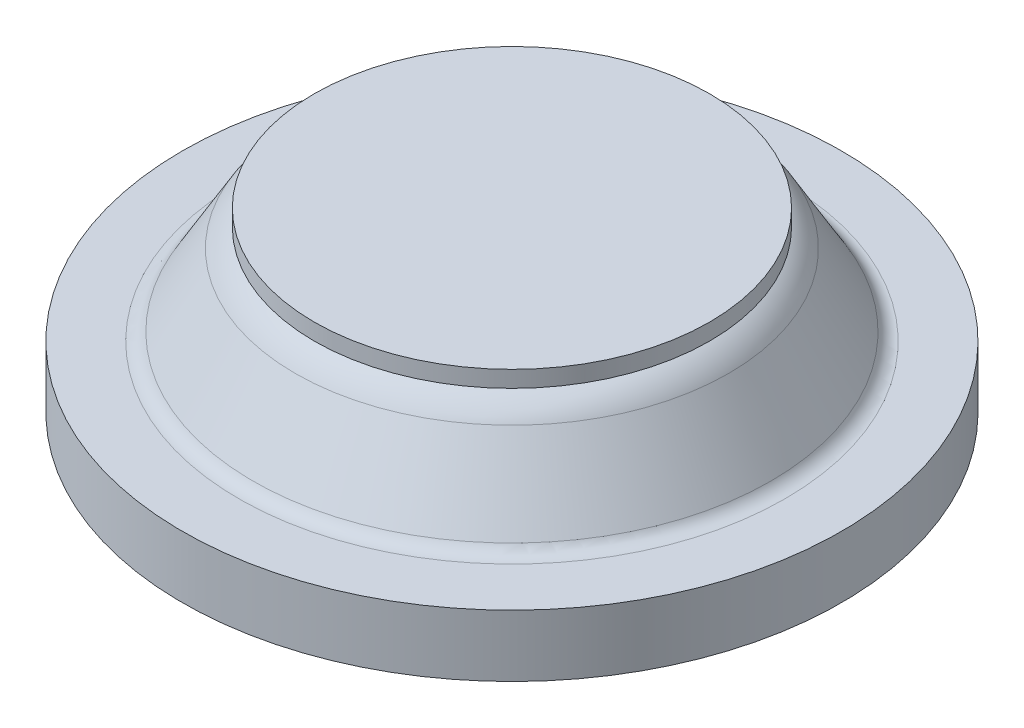
ISO-10303-21;
HEADER;
FILE_DESCRIPTION(('STEP AP214'),'2;1');
FILE_NAME('part.step','',(''),(''),'','','');
FILE_SCHEMA(('AUTOMOTIVE_DESIGN { 1 0 10303 214 1 1 1 1 }'));
ENDSEC;
DATA;
#1=APPLICATION_CONTEXT('core data for automotive mechanical design processes');
#2=APPLICATION_PROTOCOL_DEFINITION('international standard','automotive_design',2000,#1);
#3=PRODUCT_CONTEXT('',#1,'mechanical');
#4=PRODUCT('Part','Part','',(#3));
#5=PRODUCT_RELATED_PRODUCT_CATEGORY('part','',(#4));
#6=PRODUCT_DEFINITION_FORMATION('','',#4);
#7=PRODUCT_DEFINITION_CONTEXT('part definition',#1,'design');
#8=PRODUCT_DEFINITION('design','',#6,#7);
#9=PRODUCT_DEFINITION_SHAPE('','',#8);
#10=(LENGTH_UNIT() NAMED_UNIT(*) SI_UNIT(.MILLI.,.METRE.));
#11=(NAMED_UNIT(*) PLANE_ANGLE_UNIT() SI_UNIT($,.RADIAN.));
#12=(NAMED_UNIT(*) SI_UNIT($,.STERADIAN.) SOLID_ANGLE_UNIT());
#13=UNCERTAINTY_MEASURE_WITH_UNIT(LENGTH_MEASURE(1.E-05),#10,'distance_accuracy_value','');
#14=(GEOMETRIC_REPRESENTATION_CONTEXT(3) GLOBAL_UNCERTAINTY_ASSIGNED_CONTEXT((#13)) GLOBAL_UNIT_ASSIGNED_CONTEXT((#10,
#11,#12)) REPRESENTATION_CONTEXT('',''));
#15=CARTESIAN_POINT('',(0.,0.,0.));
#16=DIRECTION('',(0.,0.,1.));
#17=DIRECTION('',(1.,0.,0.));
#18=AXIS2_PLACEMENT_3D('',#15,#16,#17);
#19=CARTESIAN_POINT('',(0.,-15.24,0.));
#20=DIRECTION('',(0.,-1.,0.));
#21=DIRECTION('',(1.,0.,0.));
#22=AXIS2_PLACEMENT_3D('',#19,#20,#21);
#23=CONICAL_SURFACE('',#22,40.64,0.528074448426359);
#24=CARTESIAN_POINT('',(0.,-2.84958463915346,0.));
#25=DIRECTION('',(0.,1.,0.));
#26=DIRECTION('',(-1.,0.,0.));
#27=AXIS2_PLACEMENT_3D('',#24,#25,#26);
#28=CIRCLE('',#27,33.4122577061729);
#29=CARTESIAN_POINT('',(-33.4122577061729,-2.84958463915347,0.));
#30=VERTEX_POINT('',#29);
#31=EDGE_CURVE('E10',#30,#30,#28,.F.);
#32=ORIENTED_EDGE('',*,*,#31,.T.);
#33=EDGE_LOOP('',(#32));
#34=FACE_BOUND('',#33,.T.);
#35=CARTESIAN_POINT('',(0.,-13.9798324048312,0.));
#36=DIRECTION('',(0.,-1.,0.));
#37=DIRECTION('',(1.,0.,0.));
#38=AXIS2_PLACEMENT_3D('',#35,#36,#37);
#39=CIRCLE('',#38,39.9049022361515);
#40=CARTESIAN_POINT('',(39.9049022361515,-13.9798324048312,0.));
#41=VERTEX_POINT('',#40);
#42=EDGE_CURVE('E39',#41,#41,#39,.F.);
#43=ORIENTED_EDGE('',*,*,#42,.T.);
#44=EDGE_LOOP('',(#43));
#45=FACE_BOUND('',#44,.T.);
#46=ADVANCED_FACE('F32',(#34,#45),#23,.T.);
#47=CARTESIAN_POINT('',(0.,2.54,0.));
#48=DIRECTION('',(0.,-1.,0.));
#49=DIRECTION('',(0.,0.,-1.));
#50=AXIS2_PLACEMENT_3D('',#47,#48,#49);
#51=CYLINDRICAL_SURFACE('',#50,30.48);
#52=CARTESIAN_POINT('',(0.,2.54,0.));
#53=DIRECTION('',(0.,1.,0.));
#54=DIRECTION('',(0.,0.,1.));
#55=AXIS2_PLACEMENT_3D('',#52,#53,#54);
#56=CIRCLE('',#55,30.48);
#57=CARTESIAN_POINT('',(0.,2.54,30.48));
#58=VERTEX_POINT('',#57);
#59=EDGE_CURVE('E52',#58,#58,#56,.T.);
#60=ORIENTED_EDGE('',*,*,#59,.F.);
#61=EDGE_LOOP('',(#60));
#62=FACE_BOUND('',#61,.T.);
#63=CARTESIAN_POINT('',(0.,0.,0.));
#64=DIRECTION('',(0.,-1.,0.));
#65=DIRECTION('',(1.,0.,0.));
#66=AXIS2_PLACEMENT_3D('',#63,#64,#65);
#67=CIRCLE('',#66,30.48);
#68=CARTESIAN_POINT('',(30.48,0.,0.));
#69=VERTEX_POINT('',#68);
#70=EDGE_CURVE('E47',#69,#69,#67,.F.);
#71=ORIENTED_EDGE('',*,*,#70,.T.);
#72=EDGE_LOOP('',(#71));
#73=FACE_BOUND('',#72,.T.);
#74=ADVANCED_FACE('F83',(#62,#73),#51,.T.);
#75=CARTESIAN_POINT('',(0.,2.54,0.));
#76=DIRECTION('',(0.,1.,0.));
#77=DIRECTION('',(0.,0.,1.));
#78=AXIS2_PLACEMENT_3D('',#75,#76,#77);
#79=PLANE('',#78);
#80=ORIENTED_EDGE('',*,*,#59,.T.);
#81=EDGE_LOOP('',(#80));
#82=FACE_BOUND('',#81,.T.);
#83=ADVANCED_FACE('F67',(#82),#79,.T.);
#84=CARTESIAN_POINT('',(0.,-24.765,0.));
#85=DIRECTION('',(0.,1.,0.));
#86=DIRECTION('',(-1.,0.,0.));
#87=AXIS2_PLACEMENT_3D('',#84,#85,#86);
#88=CYLINDRICAL_SURFACE('',#87,50.8);
#89=CARTESIAN_POINT('',(0.,-24.765,0.));
#90=DIRECTION('',(0.,-1.,0.));
#91=DIRECTION('',(1.,0.,0.));
#92=AXIS2_PLACEMENT_3D('',#89,#90,#91);
#93=CIRCLE('',#92,50.8);
#94=CARTESIAN_POINT('',(-50.8,-24.765,0.));
#95=VERTEX_POINT('',#94);
#96=EDGE_CURVE('E55',#95,#95,#93,.T.);
#97=CARTESIAN_POINT('',(0.,-15.24,0.));
#98=DIRECTION('',(0.,-1.,0.));
#99=DIRECTION('',(1.,0.,0.));
#100=AXIS2_PLACEMENT_3D('',#97,#98,#99);
#101=CIRCLE('',#100,50.8);
#102=CARTESIAN_POINT('',(-50.8,-15.24,0.));
#103=VERTEX_POINT('',#102);
#104=EDGE_CURVE('E56',#103,#103,#101,.T.);
#105=CARTESIAN_POINT('',(-50.8,-24.765,0.));
#106=CARTESIAN_POINT('',(-50.8,-24.66578125,0.));
#107=CARTESIAN_POINT('',(-50.8,-24.5665625,0.));
#108=CARTESIAN_POINT('',(-50.8,-24.368125,0.));
#109=CARTESIAN_POINT('',(-50.8,-24.26890625,0.));
#110=CARTESIAN_POINT('',(-50.8,-24.07046875,0.));
#111=CARTESIAN_POINT('',(-50.8,-23.97125,0.));
#112=CARTESIAN_POINT('',(-50.8,-23.7728125,0.));
#113=CARTESIAN_POINT('',(-50.8,-23.67359375,0.));
#114=CARTESIAN_POINT('',(-50.8,-23.47515625,0.));
#115=CARTESIAN_POINT('',(-50.8,-23.3759375,0.));
#116=CARTESIAN_POINT('',(-50.8,-23.1775,0.));
#117=CARTESIAN_POINT('',(-50.8,-23.07828125,0.));
#118=CARTESIAN_POINT('',(-50.8,-22.87984375,0.));
#119=CARTESIAN_POINT('',(-50.8,-22.780625,0.));
#120=CARTESIAN_POINT('',(-50.8,-22.5821875,0.));
#121=CARTESIAN_POINT('',(-50.8,-22.48296875,0.));
#122=CARTESIAN_POINT('',(-50.8,-22.28453125,0.));
#123=CARTESIAN_POINT('',(-50.8,-22.1853125,0.));
#124=CARTESIAN_POINT('',(-50.8,-21.986875,0.));
#125=CARTESIAN_POINT('',(-50.8,-21.88765625,0.));
#126=CARTESIAN_POINT('',(-50.8,-21.68921875,0.));
#127=CARTESIAN_POINT('',(-50.8,-21.59,0.));
#128=CARTESIAN_POINT('',(-50.8,-21.3915625,0.));
#129=CARTESIAN_POINT('',(-50.8,-21.29234375,0.));
#130=CARTESIAN_POINT('',(-50.8,-21.09390625,0.));
#131=CARTESIAN_POINT('',(-50.8,-20.9946875,0.));
#132=CARTESIAN_POINT('',(-50.8,-20.79625,0.));
#133=CARTESIAN_POINT('',(-50.8,-20.69703125,0.));
#134=CARTESIAN_POINT('',(-50.8,-20.49859375,0.));
#135=CARTESIAN_POINT('',(-50.8,-20.399375,0.));
#136=CARTESIAN_POINT('',(-50.8,-20.2009375,0.));
#137=CARTESIAN_POINT('',(-50.8,-20.10171875,0.));
#138=CARTESIAN_POINT('',(-50.8,-19.90328125,0.));
#139=CARTESIAN_POINT('',(-50.8,-19.8040625,0.));
#140=CARTESIAN_POINT('',(-50.8,-19.605625,0.));
#141=CARTESIAN_POINT('',(-50.8,-19.50640625,0.));
#142=CARTESIAN_POINT('',(-50.8,-19.30796875,0.));
#143=CARTESIAN_POINT('',(-50.8,-19.20875,0.));
#144=CARTESIAN_POINT('',(-50.8,-19.0103125,0.));
#145=CARTESIAN_POINT('',(-50.8,-18.91109375,0.));
#146=CARTESIAN_POINT('',(-50.8,-18.71265625,0.));
#147=CARTESIAN_POINT('',(-50.8,-18.6134375,0.));
#148=CARTESIAN_POINT('',(-50.8,-18.415,0.));
#149=CARTESIAN_POINT('',(-50.8,-18.31578125,0.));
#150=CARTESIAN_POINT('',(-50.8,-18.11734375,0.));
#151=CARTESIAN_POINT('',(-50.8,-18.018125,0.));
#152=CARTESIAN_POINT('',(-50.8,-17.8196875,0.));
#153=CARTESIAN_POINT('',(-50.8,-17.72046875,0.));
#154=CARTESIAN_POINT('',(-50.8,-17.52203125,0.));
#155=CARTESIAN_POINT('',(-50.8,-17.4228125,0.));
#156=CARTESIAN_POINT('',(-50.8,-17.224375,0.));
#157=CARTESIAN_POINT('',(-50.8,-17.12515625,0.));
#158=CARTESIAN_POINT('',(-50.8,-16.92671875,0.));
#159=CARTESIAN_POINT('',(-50.8,-16.8275,0.));
#160=CARTESIAN_POINT('',(-50.8,-16.6290625,0.));
#161=CARTESIAN_POINT('',(-50.8,-16.52984375,0.));
#162=CARTESIAN_POINT('',(-50.8,-16.33140625,0.));
#163=CARTESIAN_POINT('',(-50.8,-16.2321875,0.));
#164=CARTESIAN_POINT('',(-50.8,-16.03375,0.));
#165=CARTESIAN_POINT('',(-50.8,-15.93453125,0.));
#166=CARTESIAN_POINT('',(-50.8,-15.73609375,0.));
#167=CARTESIAN_POINT('',(-50.8,-15.636875,0.));
#168=CARTESIAN_POINT('',(-50.8,-15.4384375,0.));
#169=CARTESIAN_POINT('',(-50.8,-15.33921875,0.));
#170=CARTESIAN_POINT('',(-50.8,-15.24,0.));
#171=B_SPLINE_CURVE_WITH_KNOTS('',3,(#105,#106,#107,#108,#109,#110,#111,#112,#113,#114,#115,
#116,#117,#118,#119,#120,#121,#122,#123,#124,#125,#126,#127,#128,#129,#130,#131,#132,#133,#134,
#135,#136,#137,#138,#139,#140,#141,#142,#143,#144,#145,#146,#147,#148,#149,#150,#151,#152,#153,
#154,#155,#156,#157,#158,#159,#160,#161,#162,#163,#164,#165,#166,#167,#168,#169,#170),
.UNSPECIFIED.,.F.,.F.,(4,2,2,2,2,2,2,2,2,2,2,2,2,2,2,2,2,2,2,2,2,2,2,2,2,2,2,2,2,2,2,2,4),(0.,
0.297656249999997,0.595312499999997,0.892968749999997,1.190625,1.48828125,1.7859375,2.08359375,
2.38125,2.67890625,2.9765625,3.27421875,3.571875,3.86953125,4.1671875,4.46484375,4.7625,
5.06015625,5.3578125,5.65546875,5.953125,6.25078125,6.5484375,6.84609375,7.14375,7.44140625,
7.7390625,8.03671875,8.334375,8.63203125,8.9296875,9.22734375,9.525),.UNSPECIFIED.);
#172=EDGE_CURVE('BSEAM64',#95,#103,#171,.T.);
#173=ORIENTED_EDGE('',*,*,#96,.F.);
#174=ORIENTED_EDGE('',*,*,#104,.T.);
#175=ORIENTED_EDGE('',*,*,#172,.T.);
#176=ORIENTED_EDGE('',*,*,#172,.F.);
#177=EDGE_LOOP('',(#173,#175,#174,#176));
#178=FACE_BOUND('',#177,.T.);
#179=ADVANCED_FACE('F64',(#178),#88,.T.);
#180=CARTESIAN_POINT('',(0.,-24.765,0.));
#181=DIRECTION('',(0.,-1.,0.));
#182=DIRECTION('',(1.,0.,0.));
#183=AXIS2_PLACEMENT_3D('',#180,#181,#182);
#184=PLANE('',#183);
#185=ORIENTED_EDGE('',*,*,#96,.T.);
#186=EDGE_LOOP('',(#185));
#187=FACE_BOUND('',#186,.T.);
#188=ADVANCED_FACE('F62',(#187),#184,.T.);
#189=CARTESIAN_POINT('',(0.,-15.24,0.));
#190=DIRECTION('',(0.,-1.,0.));
#191=DIRECTION('',(1.,0.,0.));
#192=AXIS2_PLACEMENT_3D('',#189,#190,#191);
#193=PLANE('',#192);
#194=CARTESIAN_POINT('',(0.,-15.24,0.));
#195=DIRECTION('',(0.,-1.,0.));
#196=DIRECTION('',(1.,0.,0.));
#197=AXIS2_PLACEMENT_3D('',#194,#195,#196);
#198=CIRCLE('',#197,42.0989006444335);
#199=CARTESIAN_POINT('',(42.0989006444335,-15.24,0.));
#200=VERTEX_POINT('',#199);
#201=EDGE_CURVE('E43',#200,#200,#198,.T.);
#202=ORIENTED_EDGE('',*,*,#201,.T.);
#203=EDGE_LOOP('',(#202));
#204=FACE_BOUND('',#203,.T.);
#205=ORIENTED_EDGE('',*,*,#104,.F.);
#206=EDGE_LOOP('',(#205));
#207=FACE_BOUND('',#206,.T.);
#208=ADVANCED_FACE('F71',(#204,#207),#193,.F.);
#209=CARTESIAN_POINT('',(0.,-12.7,0.));
#210=DIRECTION('',(0.,-1.,0.));
#211=DIRECTION('',(1.,0.,0.));
#212=AXIS2_PLACEMENT_3D('',#209,#210,#211);
#213=TOROIDAL_SURFACE('',#212,42.0989006444335,2.53999999999999);
#214=ORIENTED_EDGE('',*,*,#42,.F.);
#215=EDGE_LOOP('',(#214));
#216=FACE_BOUND('',#215,.T.);
#217=ORIENTED_EDGE('',*,*,#201,.F.);
#218=EDGE_LOOP('',(#217));
#219=FACE_BOUND('',#218,.T.);
#220=ADVANCED_FACE('F73',(#216,#219),#213,.F.);
#221=CARTESIAN_POINT('',(0.,-6.68908185364698,0.));
#222=DIRECTION('',(0.,1.,0.));
#223=DIRECTION('',(-1.,0.,0.));
#224=AXIS2_PLACEMENT_3D('',#221,#222,#223);
#225=TOROIDAL_SURFACE('',#224,26.8302624813268,7.61999999999999);
#226=ORIENTED_EDGE('',*,*,#31,.F.);
#227=EDGE_LOOP('',(#226));
#228=FACE_BOUND('',#227,.T.);
#229=ORIENTED_EDGE('',*,*,#70,.F.);
#230=EDGE_LOOP('',(#229));
#231=FACE_BOUND('',#230,.T.);
#232=ADVANCED_FACE('F34',(#228,#231),#225,.T.);
#233=CLOSED_SHELL('',(#46,#74,#83,#179,#188,#208,#220,#232));
#234=MANIFOLD_SOLID_BREP('B2',#233);
#235=ADVANCED_BREP_SHAPE_REPRESENTATION('',(#18,#234),#14);
#236=SHAPE_DEFINITION_REPRESENTATION(#9,#235);
ENDSEC;
END-ISO-10303-21;
